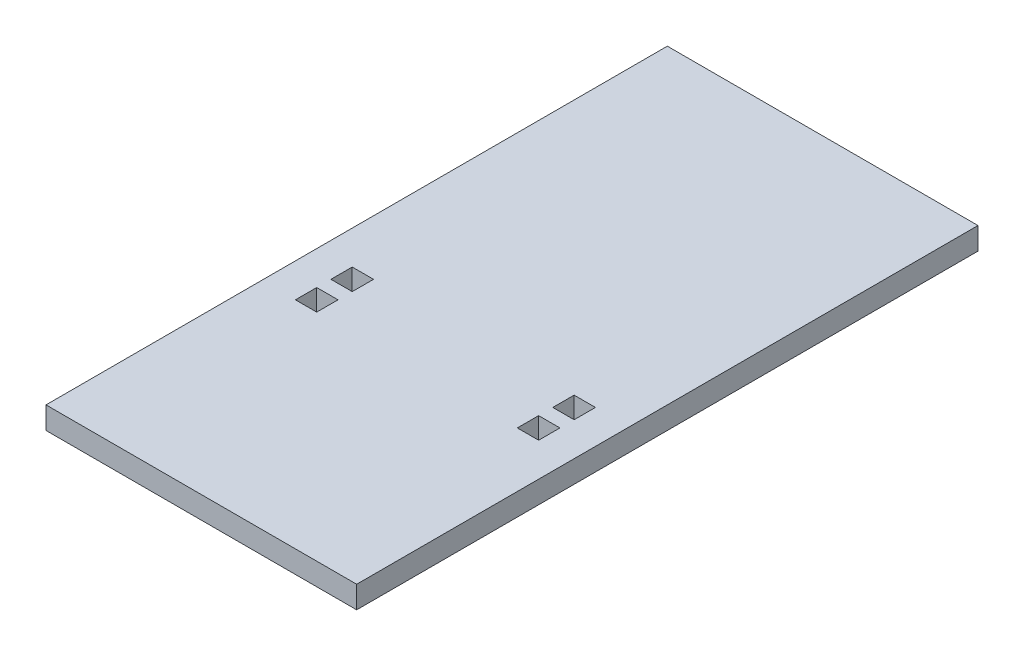
ISO-10303-21;
HEADER;
FILE_DESCRIPTION(('STEP AP214'),'2;1');
FILE_NAME('part.step','',(''),(''),'','','');
FILE_SCHEMA(('AUTOMOTIVE_DESIGN { 1 0 10303 214 1 1 1 1 }'));
ENDSEC;
DATA;
#1=APPLICATION_CONTEXT('core data for automotive mechanical design processes');
#2=APPLICATION_PROTOCOL_DEFINITION('international standard','automotive_design',2000,#1);
#3=PRODUCT_CONTEXT('',#1,'mechanical');
#4=PRODUCT('Part','Part','',(#3));
#5=PRODUCT_RELATED_PRODUCT_CATEGORY('part','',(#4));
#6=PRODUCT_DEFINITION_FORMATION('','',#4);
#7=PRODUCT_DEFINITION_CONTEXT('part definition',#1,'design');
#8=PRODUCT_DEFINITION('design','',#6,#7);
#9=PRODUCT_DEFINITION_SHAPE('','',#8);
#10=(LENGTH_UNIT() NAMED_UNIT(*) SI_UNIT(.MILLI.,.METRE.));
#11=(NAMED_UNIT(*) PLANE_ANGLE_UNIT() SI_UNIT($,.RADIAN.));
#12=(NAMED_UNIT(*) SI_UNIT($,.STERADIAN.) SOLID_ANGLE_UNIT());
#13=UNCERTAINTY_MEASURE_WITH_UNIT(LENGTH_MEASURE(1.E-05),#10,'distance_accuracy_value','');
#14=(GEOMETRIC_REPRESENTATION_CONTEXT(3) GLOBAL_UNCERTAINTY_ASSIGNED_CONTEXT((#13)) GLOBAL_UNIT_ASSIGNED_CONTEXT((#10,
#11,#12)) REPRESENTATION_CONTEXT('',''));
#15=CARTESIAN_POINT('',(0.,0.,0.));
#16=DIRECTION('',(0.,0.,1.));
#17=DIRECTION('',(1.,0.,0.));
#18=AXIS2_PLACEMENT_3D('',#15,#16,#17);
#19=CARTESIAN_POINT('',(0.,5.,0.));
#20=DIRECTION('',(0.,-1.,0.));
#21=DIRECTION('',(0.,0.,-1.));
#22=AXIS2_PLACEMENT_3D('',#19,#20,#21);
#23=PLANE('',#22);
#24=DIRECTION('',(-1.,0.,0.));
#25=VECTOR('',#24,1.);
#26=CARTESIAN_POINT('',(27.4,5.,8.60000000000003));
#27=LINE('',#26,#25);
#28=CARTESIAN_POINT('',(27.4,5.,8.60000000000003));
#29=VERTEX_POINT('',#28);
#30=CARTESIAN_POINT('',(22.6,5.,8.60000000000003));
#31=VERTEX_POINT('',#30);
#32=EDGE_CURVE('E208',#29,#31,#27,.T.);
#33=ORIENTED_EDGE('',*,*,#32,.F.);
#34=DIRECTION('',(0.,0.,-1.));
#35=VECTOR('',#34,1.);
#36=CARTESIAN_POINT('',(27.4,5.,8.60000000000003));
#37=LINE('',#36,#35);
#38=CARTESIAN_POINT('',(27.4,5.,13.4));
#39=VERTEX_POINT('',#38);
#40=EDGE_CURVE('E216',#39,#29,#37,.T.);
#41=ORIENTED_EDGE('',*,*,#40,.F.);
#42=DIRECTION('',(1.,0.,0.));
#43=VECTOR('',#42,1.);
#44=CARTESIAN_POINT('',(27.4,5.,13.4));
#45=LINE('',#44,#43);
#46=CARTESIAN_POINT('',(22.6,5.,13.4));
#47=VERTEX_POINT('',#46);
#48=EDGE_CURVE('E213',#47,#39,#45,.T.);
#49=ORIENTED_EDGE('',*,*,#48,.F.);
#50=DIRECTION('',(0.,0.,1.));
#51=VECTOR('',#50,1.);
#52=CARTESIAN_POINT('',(22.6,5.,8.60000000000003));
#53=LINE('',#52,#51);
#54=EDGE_CURVE('E210',#31,#47,#53,.T.);
#55=ORIENTED_EDGE('',*,*,#54,.F.);
#56=EDGE_LOOP('',(#33,#41,#49,#55));
#57=FACE_BOUND('',#56,.T.);
#58=DIRECTION('',(0.,0.,-1.));
#59=VECTOR('',#58,1.);
#60=CARTESIAN_POINT('',(-22.6,5.,21.4));
#61=LINE('',#60,#59);
#62=CARTESIAN_POINT('',(-22.6,5.,21.4));
#63=VERTEX_POINT('',#62);
#64=CARTESIAN_POINT('',(-22.6,5.,16.6));
#65=VERTEX_POINT('',#64);
#66=EDGE_CURVE('E270',#63,#65,#61,.T.);
#67=ORIENTED_EDGE('',*,*,#66,.F.);
#68=DIRECTION('',(1.,0.,0.));
#69=VECTOR('',#68,1.);
#70=CARTESIAN_POINT('',(-27.4,5.,21.4));
#71=LINE('',#70,#69);
#72=CARTESIAN_POINT('',(-27.4,5.,21.4));
#73=VERTEX_POINT('',#72);
#74=EDGE_CURVE('E278',#73,#63,#71,.T.);
#75=ORIENTED_EDGE('',*,*,#74,.F.);
#76=DIRECTION('',(0.,0.,1.));
#77=VECTOR('',#76,1.);
#78=CARTESIAN_POINT('',(-27.4,5.,21.4));
#79=LINE('',#78,#77);
#80=CARTESIAN_POINT('',(-27.4,5.,16.6));
#81=VERTEX_POINT('',#80);
#82=EDGE_CURVE('E275',#81,#73,#79,.T.);
#83=ORIENTED_EDGE('',*,*,#82,.F.);
#84=DIRECTION('',(-1.,0.,0.));
#85=VECTOR('',#84,1.);
#86=CARTESIAN_POINT('',(-27.4,5.,16.6));
#87=LINE('',#86,#85);
#88=EDGE_CURVE('E272',#65,#81,#87,.T.);
#89=ORIENTED_EDGE('',*,*,#88,.F.);
#90=EDGE_LOOP('',(#67,#75,#83,#89));
#91=FACE_BOUND('',#90,.T.);
#92=DIRECTION('',(0.,0.,1.));
#93=VECTOR('',#92,1.);
#94=CARTESIAN_POINT('',(-35.,5.,-70.));
#95=LINE('',#94,#93);
#96=CARTESIAN_POINT('',(-35.,5.,-70.));
#97=VERTEX_POINT('',#96);
#98=CARTESIAN_POINT('',(-35.,5.,70.));
#99=VERTEX_POINT('',#98);
#100=EDGE_CURVE('E301',#97,#99,#95,.T.);
#101=ORIENTED_EDGE('',*,*,#100,.T.);
#102=DIRECTION('',(1.,0.,0.));
#103=VECTOR('',#102,1.);
#104=CARTESIAN_POINT('',(35.,5.,70.));
#105=LINE('',#104,#103);
#106=CARTESIAN_POINT('',(35.,5.,70.));
#107=VERTEX_POINT('',#106);
#108=EDGE_CURVE('E304',#99,#107,#105,.T.);
#109=ORIENTED_EDGE('',*,*,#108,.T.);
#110=DIRECTION('',(0.,0.,-1.));
#111=VECTOR('',#110,1.);
#112=CARTESIAN_POINT('',(35.,5.,-70.));
#113=LINE('',#112,#111);
#114=CARTESIAN_POINT('',(35.,5.,-70.));
#115=VERTEX_POINT('',#114);
#116=EDGE_CURVE('E307',#107,#115,#113,.T.);
#117=ORIENTED_EDGE('',*,*,#116,.T.);
#118=DIRECTION('',(-1.,0.,0.));
#119=VECTOR('',#118,1.);
#120=CARTESIAN_POINT('',(35.,5.,-70.));
#121=LINE('',#120,#119);
#122=EDGE_CURVE('E309',#115,#97,#121,.T.);
#123=ORIENTED_EDGE('',*,*,#122,.T.);
#124=EDGE_LOOP('',(#101,#109,#117,#123));
#125=FACE_BOUND('',#124,.T.);
#126=DIRECTION('',(0.,0.,1.));
#127=VECTOR('',#126,1.);
#128=CARTESIAN_POINT('',(-27.4,5.,8.60000000000005));
#129=LINE('',#128,#127);
#130=CARTESIAN_POINT('',(-27.4,5.,8.60000000000005));
#131=VERTEX_POINT('',#130);
#132=CARTESIAN_POINT('',(-27.4,5.,13.4));
#133=VERTEX_POINT('',#132);
#134=EDGE_CURVE('E239',#131,#133,#129,.T.);
#135=ORIENTED_EDGE('',*,*,#134,.F.);
#136=DIRECTION('',(-1.,0.,0.));
#137=VECTOR('',#136,1.);
#138=CARTESIAN_POINT('',(-27.4,5.,8.60000000000005));
#139=LINE('',#138,#137);
#140=CARTESIAN_POINT('',(-22.6,5.,8.60000000000004));
#141=VERTEX_POINT('',#140);
#142=EDGE_CURVE('E247',#141,#131,#139,.T.);
#143=ORIENTED_EDGE('',*,*,#142,.F.);
#144=DIRECTION('',(0.,0.,-1.));
#145=VECTOR('',#144,1.);
#146=CARTESIAN_POINT('',(-22.6,5.,8.60000000000004));
#147=LINE('',#146,#145);
#148=CARTESIAN_POINT('',(-22.6,5.,13.4));
#149=VERTEX_POINT('',#148);
#150=EDGE_CURVE('E244',#149,#141,#147,.T.);
#151=ORIENTED_EDGE('',*,*,#150,.F.);
#152=DIRECTION('',(1.,0.,0.));
#153=VECTOR('',#152,1.);
#154=CARTESIAN_POINT('',(-27.4,5.,13.4));
#155=LINE('',#154,#153);
#156=EDGE_CURVE('E241',#133,#149,#155,.T.);
#157=ORIENTED_EDGE('',*,*,#156,.F.);
#158=EDGE_LOOP('',(#135,#143,#151,#157));
#159=FACE_BOUND('',#158,.T.);
#160=DIRECTION('',(0.,0.,-1.));
#161=VECTOR('',#160,1.);
#162=CARTESIAN_POINT('',(27.4,5.,21.4));
#163=LINE('',#162,#161);
#164=CARTESIAN_POINT('',(27.4,5.,21.4));
#165=VERTEX_POINT('',#164);
#166=CARTESIAN_POINT('',(27.4,5.,16.6));
#167=VERTEX_POINT('',#166);
#168=EDGE_CURVE('E172',#165,#167,#163,.T.);
#169=ORIENTED_EDGE('',*,*,#168,.F.);
#170=DIRECTION('',(1.,0.,0.));
#171=VECTOR('',#170,1.);
#172=CARTESIAN_POINT('',(27.4,5.,21.4));
#173=LINE('',#172,#171);
#174=CARTESIAN_POINT('',(22.6,5.,21.4));
#175=VERTEX_POINT('',#174);
#176=EDGE_CURVE('E194',#175,#165,#173,.T.);
#177=ORIENTED_EDGE('',*,*,#176,.F.);
#178=DIRECTION('',(0.,0.,1.));
#179=VECTOR('',#178,1.);
#180=CARTESIAN_POINT('',(22.6,5.,21.4));
#181=LINE('',#180,#179);
#182=CARTESIAN_POINT('',(22.6,5.,16.6));
#183=VERTEX_POINT('',#182);
#184=EDGE_CURVE('E192',#183,#175,#181,.T.);
#185=ORIENTED_EDGE('',*,*,#184,.F.);
#186=DIRECTION('',(-1.,0.,0.));
#187=VECTOR('',#186,1.);
#188=CARTESIAN_POINT('',(27.4,5.,16.6));
#189=LINE('',#188,#187);
#190=EDGE_CURVE('E180',#167,#183,#189,.T.);
#191=ORIENTED_EDGE('',*,*,#190,.F.);
#192=EDGE_LOOP('',(#169,#177,#185,#191));
#193=FACE_BOUND('',#192,.T.);
#194=ADVANCED_FACE('F35',(#57,#91,#125,#159,#193),#23,.F.);
#195=CARTESIAN_POINT('',(0.,0.,0.));
#196=DIRECTION('',(0.,-1.,0.));
#197=DIRECTION('',(0.,0.,-1.));
#198=AXIS2_PLACEMENT_3D('',#195,#196,#197);
#199=PLANE('',#198);
#200=DIRECTION('',(0.,0.,1.));
#201=VECTOR('',#200,1.);
#202=CARTESIAN_POINT('',(-35.,0.,-70.));
#203=LINE('',#202,#201);
#204=CARTESIAN_POINT('',(-35.,0.,-70.));
#205=VERTEX_POINT('',#204);
#206=CARTESIAN_POINT('',(-35.,0.,70.));
#207=VERTEX_POINT('',#206);
#208=EDGE_CURVE('E300',#205,#207,#203,.T.);
#209=ORIENTED_EDGE('',*,*,#208,.F.);
#210=DIRECTION('',(-1.,0.,0.));
#211=VECTOR('',#210,1.);
#212=CARTESIAN_POINT('',(35.,0.,-70.));
#213=LINE('',#212,#211);
#214=CARTESIAN_POINT('',(35.,0.,-70.));
#215=VERTEX_POINT('',#214);
#216=EDGE_CURVE('E305',#215,#205,#213,.T.);
#217=ORIENTED_EDGE('',*,*,#216,.F.);
#218=DIRECTION('',(0.,0.,-1.));
#219=VECTOR('',#218,1.);
#220=CARTESIAN_POINT('',(35.,0.,-70.));
#221=LINE('',#220,#219);
#222=CARTESIAN_POINT('',(35.,0.,70.));
#223=VERTEX_POINT('',#222);
#224=EDGE_CURVE('E316',#223,#215,#221,.T.);
#225=ORIENTED_EDGE('',*,*,#224,.F.);
#226=DIRECTION('',(1.,0.,0.));
#227=VECTOR('',#226,1.);
#228=CARTESIAN_POINT('',(35.,0.,70.));
#229=LINE('',#228,#227);
#230=EDGE_CURVE('E314',#207,#223,#229,.T.);
#231=ORIENTED_EDGE('',*,*,#230,.F.);
#232=EDGE_LOOP('',(#209,#217,#225,#231));
#233=FACE_BOUND('',#232,.T.);
#234=DIRECTION('',(1.,0.,0.));
#235=VECTOR('',#234,1.);
#236=CARTESIAN_POINT('',(-27.4,0.,21.4));
#237=LINE('',#236,#235);
#238=CARTESIAN_POINT('',(-27.4,0.,21.4));
#239=VERTEX_POINT('',#238);
#240=CARTESIAN_POINT('',(-22.6,0.,21.4));
#241=VERTEX_POINT('',#240);
#242=EDGE_CURVE('E273',#239,#241,#237,.T.);
#243=ORIENTED_EDGE('',*,*,#242,.T.);
#244=DIRECTION('',(0.,0.,-1.));
#245=VECTOR('',#244,1.);
#246=CARTESIAN_POINT('',(-22.6,0.,21.4));
#247=LINE('',#246,#245);
#248=CARTESIAN_POINT('',(-22.6,0.,16.6));
#249=VERTEX_POINT('',#248);
#250=EDGE_CURVE('E269',#241,#249,#247,.T.);
#251=ORIENTED_EDGE('',*,*,#250,.T.);
#252=DIRECTION('',(-1.,0.,0.));
#253=VECTOR('',#252,1.);
#254=CARTESIAN_POINT('',(-27.4,0.,16.6));
#255=LINE('',#254,#253);
#256=CARTESIAN_POINT('',(-27.4,0.,16.6));
#257=VERTEX_POINT('',#256);
#258=EDGE_CURVE('E283',#249,#257,#255,.T.);
#259=ORIENTED_EDGE('',*,*,#258,.T.);
#260=DIRECTION('',(0.,0.,1.));
#261=VECTOR('',#260,1.);
#262=CARTESIAN_POINT('',(-27.4,0.,21.4));
#263=LINE('',#262,#261);
#264=EDGE_CURVE('E286',#257,#239,#263,.T.);
#265=ORIENTED_EDGE('',*,*,#264,.T.);
#266=EDGE_LOOP('',(#243,#251,#259,#265));
#267=FACE_BOUND('',#266,.T.);
#268=DIRECTION('',(-1.,0.,0.));
#269=VECTOR('',#268,1.);
#270=CARTESIAN_POINT('',(-27.4,0.,8.60000000000005));
#271=LINE('',#270,#269);
#272=CARTESIAN_POINT('',(-22.6,0.,8.60000000000004));
#273=VERTEX_POINT('',#272);
#274=CARTESIAN_POINT('',(-27.4,0.,8.60000000000005));
#275=VERTEX_POINT('',#274);
#276=EDGE_CURVE('E242',#273,#275,#271,.T.);
#277=ORIENTED_EDGE('',*,*,#276,.T.);
#278=DIRECTION('',(0.,0.,1.));
#279=VECTOR('',#278,1.);
#280=CARTESIAN_POINT('',(-27.4,0.,8.60000000000005));
#281=LINE('',#280,#279);
#282=CARTESIAN_POINT('',(-27.4,0.,13.4));
#283=VERTEX_POINT('',#282);
#284=EDGE_CURVE('E238',#275,#283,#281,.T.);
#285=ORIENTED_EDGE('',*,*,#284,.T.);
#286=DIRECTION('',(1.,0.,0.));
#287=VECTOR('',#286,1.);
#288=CARTESIAN_POINT('',(-27.4,0.,13.4));
#289=LINE('',#288,#287);
#290=CARTESIAN_POINT('',(-22.6,0.,13.4));
#291=VERTEX_POINT('',#290);
#292=EDGE_CURVE('E252',#283,#291,#289,.T.);
#293=ORIENTED_EDGE('',*,*,#292,.T.);
#294=DIRECTION('',(0.,0.,-1.));
#295=VECTOR('',#294,1.);
#296=CARTESIAN_POINT('',(-22.6,0.,8.60000000000004));
#297=LINE('',#296,#295);
#298=EDGE_CURVE('E255',#291,#273,#297,.T.);
#299=ORIENTED_EDGE('',*,*,#298,.T.);
#300=EDGE_LOOP('',(#277,#285,#293,#299));
#301=FACE_BOUND('',#300,.T.);
#302=DIRECTION('',(0.,0.,-1.));
#303=VECTOR('',#302,1.);
#304=CARTESIAN_POINT('',(27.4,0.,8.60000000000003));
#305=LINE('',#304,#303);
#306=CARTESIAN_POINT('',(27.4,0.,13.4));
#307=VERTEX_POINT('',#306);
#308=CARTESIAN_POINT('',(27.4,0.,8.60000000000003));
#309=VERTEX_POINT('',#308);
#310=EDGE_CURVE('E211',#307,#309,#305,.T.);
#311=ORIENTED_EDGE('',*,*,#310,.T.);
#312=DIRECTION('',(-1.,0.,0.));
#313=VECTOR('',#312,1.);
#314=CARTESIAN_POINT('',(27.4,0.,8.60000000000003));
#315=LINE('',#314,#313);
#316=CARTESIAN_POINT('',(22.6,0.,8.60000000000003));
#317=VERTEX_POINT('',#316);
#318=EDGE_CURVE('E188',#309,#317,#315,.T.);
#319=ORIENTED_EDGE('',*,*,#318,.T.);
#320=DIRECTION('',(0.,0.,1.));
#321=VECTOR('',#320,1.);
#322=CARTESIAN_POINT('',(22.6,0.,8.60000000000003));
#323=LINE('',#322,#321);
#324=CARTESIAN_POINT('',(22.6,0.,13.4));
#325=VERTEX_POINT('',#324);
#326=EDGE_CURVE('E221',#317,#325,#323,.T.);
#327=ORIENTED_EDGE('',*,*,#326,.T.);
#328=DIRECTION('',(1.,0.,0.));
#329=VECTOR('',#328,1.);
#330=CARTESIAN_POINT('',(27.4,0.,13.4));
#331=LINE('',#330,#329);
#332=EDGE_CURVE('E224',#325,#307,#331,.T.);
#333=ORIENTED_EDGE('',*,*,#332,.T.);
#334=EDGE_LOOP('',(#311,#319,#327,#333));
#335=FACE_BOUND('',#334,.T.);
#336=DIRECTION('',(1.,0.,0.));
#337=VECTOR('',#336,1.);
#338=CARTESIAN_POINT('',(27.4,0.,21.4));
#339=LINE('',#338,#337);
#340=CARTESIAN_POINT('',(22.6,0.,21.4));
#341=VERTEX_POINT('',#340);
#342=CARTESIAN_POINT('',(27.4,0.,21.4));
#343=VERTEX_POINT('',#342);
#344=EDGE_CURVE('E181',#341,#343,#339,.T.);
#345=ORIENTED_EDGE('',*,*,#344,.T.);
#346=DIRECTION('',(0.,0.,-1.));
#347=VECTOR('',#346,1.);
#348=CARTESIAN_POINT('',(27.4,0.,21.4));
#349=LINE('',#348,#347);
#350=CARTESIAN_POINT('',(27.4,0.,16.6));
#351=VERTEX_POINT('',#350);
#352=EDGE_CURVE('E58',#343,#351,#349,.T.);
#353=ORIENTED_EDGE('',*,*,#352,.T.);
#354=DIRECTION('',(-1.,0.,0.));
#355=VECTOR('',#354,1.);
#356=CARTESIAN_POINT('',(27.4,0.,16.6));
#357=LINE('',#356,#355);
#358=CARTESIAN_POINT('',(22.6,0.,16.6));
#359=VERTEX_POINT('',#358);
#360=EDGE_CURVE('E187',#351,#359,#357,.T.);
#361=ORIENTED_EDGE('',*,*,#360,.T.);
#362=DIRECTION('',(0.,0.,1.));
#363=VECTOR('',#362,1.);
#364=CARTESIAN_POINT('',(22.6,0.,21.4));
#365=LINE('',#364,#363);
#366=EDGE_CURVE('E200',#359,#341,#365,.T.);
#367=ORIENTED_EDGE('',*,*,#366,.T.);
#368=EDGE_LOOP('',(#345,#353,#361,#367));
#369=FACE_BOUND('',#368,.T.);
#370=ADVANCED_FACE('F334',(#233,#267,#301,#335,#369),#199,.T.);
#371=CARTESIAN_POINT('',(-35.,5.,-70.));
#372=DIRECTION('',(1.,0.,0.));
#373=DIRECTION('',(0.,0.,-1.));
#374=AXIS2_PLACEMENT_3D('',#371,#372,#373);
#375=PLANE('',#374);
#376=ORIENTED_EDGE('',*,*,#208,.T.);
#377=DIRECTION('',(0.,-1.,0.));
#378=VECTOR('',#377,1.);
#379=CARTESIAN_POINT('',(-35.,5.,70.));
#380=LINE('',#379,#378);
#381=EDGE_CURVE('E11',#99,#207,#380,.T.);
#382=ORIENTED_EDGE('',*,*,#381,.F.);
#383=ORIENTED_EDGE('',*,*,#100,.F.);
#384=DIRECTION('',(0.,-1.,0.));
#385=VECTOR('',#384,1.);
#386=CARTESIAN_POINT('',(-35.,5.,-70.));
#387=LINE('',#386,#385);
#388=EDGE_CURVE('E311',#97,#205,#387,.T.);
#389=ORIENTED_EDGE('',*,*,#388,.T.);
#390=EDGE_LOOP('',(#376,#382,#383,#389));
#391=FACE_BOUND('',#390,.T.);
#392=ADVANCED_FACE('F37',(#391),#375,.F.);
#393=CARTESIAN_POINT('',(35.,5.,70.));
#394=DIRECTION('',(0.,0.,-1.));
#395=DIRECTION('',(-1.,0.,0.));
#396=AXIS2_PLACEMENT_3D('',#393,#394,#395);
#397=PLANE('',#396);
#398=ORIENTED_EDGE('',*,*,#230,.T.);
#399=DIRECTION('',(0.,-1.,0.));
#400=VECTOR('',#399,1.);
#401=CARTESIAN_POINT('',(35.,5.,70.));
#402=LINE('',#401,#400);
#403=EDGE_CURVE('E43',#107,#223,#402,.T.);
#404=ORIENTED_EDGE('',*,*,#403,.F.);
#405=ORIENTED_EDGE('',*,*,#108,.F.);
#406=ORIENTED_EDGE('',*,*,#381,.T.);
#407=EDGE_LOOP('',(#398,#404,#405,#406));
#408=FACE_BOUND('',#407,.T.);
#409=ADVANCED_FACE('F345',(#408),#397,.F.);
#410=CARTESIAN_POINT('',(35.,5.,-70.));
#411=DIRECTION('',(-1.,0.,0.));
#412=DIRECTION('',(0.,0.,1.));
#413=AXIS2_PLACEMENT_3D('',#410,#411,#412);
#414=PLANE('',#413);
#415=ORIENTED_EDGE('',*,*,#224,.T.);
#416=DIRECTION('',(0.,-1.,0.));
#417=VECTOR('',#416,1.);
#418=CARTESIAN_POINT('',(35.,5.,-70.));
#419=LINE('',#418,#417);
#420=EDGE_CURVE('E321',#115,#215,#419,.T.);
#421=ORIENTED_EDGE('',*,*,#420,.F.);
#422=ORIENTED_EDGE('',*,*,#116,.F.);
#423=ORIENTED_EDGE('',*,*,#403,.T.);
#424=EDGE_LOOP('',(#415,#421,#422,#423));
#425=FACE_BOUND('',#424,.T.);
#426=ADVANCED_FACE('F328',(#425),#414,.F.);
#427=CARTESIAN_POINT('',(35.,5.,-70.));
#428=DIRECTION('',(0.,0.,1.));
#429=DIRECTION('',(1.,0.,0.));
#430=AXIS2_PLACEMENT_3D('',#427,#428,#429);
#431=PLANE('',#430);
#432=ORIENTED_EDGE('',*,*,#216,.T.);
#433=ORIENTED_EDGE('',*,*,#388,.F.);
#434=ORIENTED_EDGE('',*,*,#122,.F.);
#435=ORIENTED_EDGE('',*,*,#420,.T.);
#436=EDGE_LOOP('',(#432,#433,#434,#435));
#437=FACE_BOUND('',#436,.T.);
#438=ADVANCED_FACE('F338',(#437),#431,.F.);
#439=CARTESIAN_POINT('',(-22.6,5.,21.4));
#440=DIRECTION('',(-1.,0.,0.));
#441=DIRECTION('',(0.,0.,1.));
#442=AXIS2_PLACEMENT_3D('',#439,#440,#441);
#443=PLANE('',#442);
#444=ORIENTED_EDGE('',*,*,#250,.F.);
#445=DIRECTION('',(0.,-1.,0.));
#446=VECTOR('',#445,1.);
#447=CARTESIAN_POINT('',(-22.6,5.,21.4));
#448=LINE('',#447,#446);
#449=EDGE_CURVE('E280',#63,#241,#448,.T.);
#450=ORIENTED_EDGE('',*,*,#449,.F.);
#451=ORIENTED_EDGE('',*,*,#66,.T.);
#452=DIRECTION('',(0.,-1.,0.));
#453=VECTOR('',#452,1.);
#454=CARTESIAN_POINT('',(-22.6,5.,16.6));
#455=LINE('',#454,#453);
#456=EDGE_CURVE('E297',#65,#249,#455,.T.);
#457=ORIENTED_EDGE('',*,*,#456,.T.);
#458=EDGE_LOOP('',(#444,#450,#451,#457));
#459=FACE_BOUND('',#458,.T.);
#460=ADVANCED_FACE('F362',(#459),#443,.T.);
#461=CARTESIAN_POINT('',(-27.4,5.,16.6));
#462=DIRECTION('',(0.,0.,1.));
#463=DIRECTION('',(1.,0.,0.));
#464=AXIS2_PLACEMENT_3D('',#461,#462,#463);
#465=PLANE('',#464);
#466=ORIENTED_EDGE('',*,*,#258,.F.);
#467=ORIENTED_EDGE('',*,*,#456,.F.);
#468=ORIENTED_EDGE('',*,*,#88,.T.);
#469=DIRECTION('',(0.,-1.,0.));
#470=VECTOR('',#469,1.);
#471=CARTESIAN_POINT('',(-27.4,5.,16.6));
#472=LINE('',#471,#470);
#473=EDGE_CURVE('E295',#81,#257,#472,.T.);
#474=ORIENTED_EDGE('',*,*,#473,.T.);
#475=EDGE_LOOP('',(#466,#467,#468,#474));
#476=FACE_BOUND('',#475,.T.);
#477=ADVANCED_FACE('F369',(#476),#465,.T.);
#478=CARTESIAN_POINT('',(-27.4,5.,21.4));
#479=DIRECTION('',(1.,0.,0.));
#480=DIRECTION('',(0.,0.,-1.));
#481=AXIS2_PLACEMENT_3D('',#478,#479,#480);
#482=PLANE('',#481);
#483=ORIENTED_EDGE('',*,*,#264,.F.);
#484=ORIENTED_EDGE('',*,*,#473,.F.);
#485=ORIENTED_EDGE('',*,*,#82,.T.);
#486=DIRECTION('',(0.,-1.,0.));
#487=VECTOR('',#486,1.);
#488=CARTESIAN_POINT('',(-27.4,5.,21.4));
#489=LINE('',#488,#487);
#490=EDGE_CURVE('E293',#73,#239,#489,.T.);
#491=ORIENTED_EDGE('',*,*,#490,.T.);
#492=EDGE_LOOP('',(#483,#484,#485,#491));
#493=FACE_BOUND('',#492,.T.);
#494=ADVANCED_FACE('F374',(#493),#482,.T.);
#495=CARTESIAN_POINT('',(-27.4,5.,21.4));
#496=DIRECTION('',(0.,0.,-1.));
#497=DIRECTION('',(-1.,0.,0.));
#498=AXIS2_PLACEMENT_3D('',#495,#496,#497);
#499=PLANE('',#498);
#500=ORIENTED_EDGE('',*,*,#242,.F.);
#501=ORIENTED_EDGE('',*,*,#490,.F.);
#502=ORIENTED_EDGE('',*,*,#74,.T.);
#503=ORIENTED_EDGE('',*,*,#449,.T.);
#504=EDGE_LOOP('',(#500,#501,#502,#503));
#505=FACE_BOUND('',#504,.T.);
#506=ADVANCED_FACE('F381',(#505),#499,.T.);
#507=CARTESIAN_POINT('',(-27.4,5.,8.60000000000005));
#508=DIRECTION('',(1.,0.,0.));
#509=DIRECTION('',(0.,0.,-1.));
#510=AXIS2_PLACEMENT_3D('',#507,#508,#509);
#511=PLANE('',#510);
#512=ORIENTED_EDGE('',*,*,#284,.F.);
#513=DIRECTION('',(0.,-1.,0.));
#514=VECTOR('',#513,1.);
#515=CARTESIAN_POINT('',(-27.4,5.,8.60000000000005));
#516=LINE('',#515,#514);
#517=EDGE_CURVE('E249',#131,#275,#516,.T.);
#518=ORIENTED_EDGE('',*,*,#517,.F.);
#519=ORIENTED_EDGE('',*,*,#134,.T.);
#520=DIRECTION('',(0.,-1.,0.));
#521=VECTOR('',#520,1.);
#522=CARTESIAN_POINT('',(-27.4,5.,13.4));
#523=LINE('',#522,#521);
#524=EDGE_CURVE('E266',#133,#283,#523,.T.);
#525=ORIENTED_EDGE('',*,*,#524,.T.);
#526=EDGE_LOOP('',(#512,#518,#519,#525));
#527=FACE_BOUND('',#526,.T.);
#528=ADVANCED_FACE('F394',(#527),#511,.T.);
#529=CARTESIAN_POINT('',(-27.4,5.,13.4));
#530=DIRECTION('',(0.,0.,-1.));
#531=DIRECTION('',(-1.,0.,0.));
#532=AXIS2_PLACEMENT_3D('',#529,#530,#531);
#533=PLANE('',#532);
#534=ORIENTED_EDGE('',*,*,#292,.F.);
#535=ORIENTED_EDGE('',*,*,#524,.F.);
#536=ORIENTED_EDGE('',*,*,#156,.T.);
#537=DIRECTION('',(0.,-1.,0.));
#538=VECTOR('',#537,1.);
#539=CARTESIAN_POINT('',(-22.6,5.,13.4));
#540=LINE('',#539,#538);
#541=EDGE_CURVE('E264',#149,#291,#540,.T.);
#542=ORIENTED_EDGE('',*,*,#541,.T.);
#543=EDGE_LOOP('',(#534,#535,#536,#542));
#544=FACE_BOUND('',#543,.T.);
#545=ADVANCED_FACE('F399',(#544),#533,.T.);
#546=CARTESIAN_POINT('',(-22.6,5.,8.60000000000004));
#547=DIRECTION('',(-1.,0.,0.));
#548=DIRECTION('',(0.,0.,1.));
#549=AXIS2_PLACEMENT_3D('',#546,#547,#548);
#550=PLANE('',#549);
#551=ORIENTED_EDGE('',*,*,#298,.F.);
#552=ORIENTED_EDGE('',*,*,#541,.F.);
#553=ORIENTED_EDGE('',*,*,#150,.T.);
#554=DIRECTION('',(0.,-1.,0.));
#555=VECTOR('',#554,1.);
#556=CARTESIAN_POINT('',(-22.6,5.,8.60000000000004));
#557=LINE('',#556,#555);
#558=EDGE_CURVE('E262',#141,#273,#557,.T.);
#559=ORIENTED_EDGE('',*,*,#558,.T.);
#560=EDGE_LOOP('',(#551,#552,#553,#559));
#561=FACE_BOUND('',#560,.T.);
#562=ADVANCED_FACE('F403',(#561),#550,.T.);
#563=CARTESIAN_POINT('',(-27.4,5.,8.60000000000005));
#564=DIRECTION('',(0.,0.,1.));
#565=DIRECTION('',(1.,0.,0.));
#566=AXIS2_PLACEMENT_3D('',#563,#564,#565);
#567=PLANE('',#566);
#568=ORIENTED_EDGE('',*,*,#276,.F.);
#569=ORIENTED_EDGE('',*,*,#558,.F.);
#570=ORIENTED_EDGE('',*,*,#142,.T.);
#571=ORIENTED_EDGE('',*,*,#517,.T.);
#572=EDGE_LOOP('',(#568,#569,#570,#571));
#573=FACE_BOUND('',#572,.T.);
#574=ADVANCED_FACE('F407',(#573),#567,.T.);
#575=CARTESIAN_POINT('',(27.4,5.,8.60000000000003));
#576=DIRECTION('',(0.,0.,1.));
#577=DIRECTION('',(1.,0.,0.));
#578=AXIS2_PLACEMENT_3D('',#575,#576,#577);
#579=PLANE('',#578);
#580=ORIENTED_EDGE('',*,*,#318,.F.);
#581=DIRECTION('',(0.,-1.,0.));
#582=VECTOR('',#581,1.);
#583=CARTESIAN_POINT('',(27.4,5.,8.60000000000003));
#584=LINE('',#583,#582);
#585=EDGE_CURVE('E218',#29,#309,#584,.T.);
#586=ORIENTED_EDGE('',*,*,#585,.F.);
#587=ORIENTED_EDGE('',*,*,#32,.T.);
#588=DIRECTION('',(0.,-1.,0.));
#589=VECTOR('',#588,1.);
#590=CARTESIAN_POINT('',(22.6,5.,8.60000000000003));
#591=LINE('',#590,#589);
#592=EDGE_CURVE('E235',#31,#317,#591,.T.);
#593=ORIENTED_EDGE('',*,*,#592,.T.);
#594=EDGE_LOOP('',(#580,#586,#587,#593));
#595=FACE_BOUND('',#594,.T.);
#596=ADVANCED_FACE('F411',(#595),#579,.T.);
#597=CARTESIAN_POINT('',(22.6,5.,8.60000000000003));
#598=DIRECTION('',(1.,0.,0.));
#599=DIRECTION('',(0.,0.,-1.));
#600=AXIS2_PLACEMENT_3D('',#597,#598,#599);
#601=PLANE('',#600);
#602=ORIENTED_EDGE('',*,*,#326,.F.);
#603=ORIENTED_EDGE('',*,*,#592,.F.);
#604=ORIENTED_EDGE('',*,*,#54,.T.);
#605=DIRECTION('',(0.,-1.,0.));
#606=VECTOR('',#605,1.);
#607=CARTESIAN_POINT('',(22.6,5.,13.4));
#608=LINE('',#607,#606);
#609=EDGE_CURVE('E233',#47,#325,#608,.T.);
#610=ORIENTED_EDGE('',*,*,#609,.T.);
#611=EDGE_LOOP('',(#602,#603,#604,#610));
#612=FACE_BOUND('',#611,.T.);
#613=ADVANCED_FACE('F415',(#612),#601,.T.);
#614=CARTESIAN_POINT('',(27.4,5.,13.4));
#615=DIRECTION('',(0.,0.,-1.));
#616=DIRECTION('',(-1.,0.,0.));
#617=AXIS2_PLACEMENT_3D('',#614,#615,#616);
#618=PLANE('',#617);
#619=ORIENTED_EDGE('',*,*,#332,.F.);
#620=ORIENTED_EDGE('',*,*,#609,.F.);
#621=ORIENTED_EDGE('',*,*,#48,.T.);
#622=DIRECTION('',(0.,-1.,0.));
#623=VECTOR('',#622,1.);
#624=CARTESIAN_POINT('',(27.4,5.,13.4));
#625=LINE('',#624,#623);
#626=EDGE_CURVE('E231',#39,#307,#625,.T.);
#627=ORIENTED_EDGE('',*,*,#626,.T.);
#628=EDGE_LOOP('',(#619,#620,#621,#627));
#629=FACE_BOUND('',#628,.T.);
#630=ADVANCED_FACE('F419',(#629),#618,.T.);
#631=CARTESIAN_POINT('',(27.4,5.,8.60000000000003));
#632=DIRECTION('',(-1.,0.,0.));
#633=DIRECTION('',(0.,0.,1.));
#634=AXIS2_PLACEMENT_3D('',#631,#632,#633);
#635=PLANE('',#634);
#636=ORIENTED_EDGE('',*,*,#310,.F.);
#637=ORIENTED_EDGE('',*,*,#626,.F.);
#638=ORIENTED_EDGE('',*,*,#40,.T.);
#639=ORIENTED_EDGE('',*,*,#585,.T.);
#640=EDGE_LOOP('',(#636,#637,#638,#639));
#641=FACE_BOUND('',#640,.T.);
#642=ADVANCED_FACE('F423',(#641),#635,.T.);
#643=CARTESIAN_POINT('',(27.4,5.,21.4));
#644=DIRECTION('',(-1.,0.,0.));
#645=DIRECTION('',(0.,0.,1.));
#646=AXIS2_PLACEMENT_3D('',#643,#644,#645);
#647=PLANE('',#646);
#648=ORIENTED_EDGE('',*,*,#352,.F.);
#649=DIRECTION('',(0.,-1.,0.));
#650=VECTOR('',#649,1.);
#651=CARTESIAN_POINT('',(27.4,5.,21.4));
#652=LINE('',#651,#650);
#653=EDGE_CURVE('E176',#165,#343,#652,.T.);
#654=ORIENTED_EDGE('',*,*,#653,.F.);
#655=ORIENTED_EDGE('',*,*,#168,.T.);
#656=DIRECTION('',(0.,-1.,0.));
#657=VECTOR('',#656,1.);
#658=CARTESIAN_POINT('',(27.4,5.,16.6));
#659=LINE('',#658,#657);
#660=EDGE_CURVE('E175',#167,#351,#659,.T.);
#661=ORIENTED_EDGE('',*,*,#660,.T.);
#662=EDGE_LOOP('',(#648,#654,#655,#661));
#663=FACE_BOUND('',#662,.T.);
#664=ADVANCED_FACE('F174',(#663),#647,.T.);
#665=CARTESIAN_POINT('',(27.4,5.,16.6));
#666=DIRECTION('',(0.,0.,1.));
#667=DIRECTION('',(1.,0.,0.));
#668=AXIS2_PLACEMENT_3D('',#665,#666,#667);
#669=PLANE('',#668);
#670=ORIENTED_EDGE('',*,*,#360,.F.);
#671=ORIENTED_EDGE('',*,*,#660,.F.);
#672=ORIENTED_EDGE('',*,*,#190,.T.);
#673=DIRECTION('',(0.,-1.,0.));
#674=VECTOR('',#673,1.);
#675=CARTESIAN_POINT('',(22.6,5.,16.6));
#676=LINE('',#675,#674);
#677=EDGE_CURVE('E189',#183,#359,#676,.T.);
#678=ORIENTED_EDGE('',*,*,#677,.T.);
#679=EDGE_LOOP('',(#670,#671,#672,#678));
#680=FACE_BOUND('',#679,.T.);
#681=ADVANCED_FACE('F184',(#680),#669,.T.);
#682=CARTESIAN_POINT('',(22.6,5.,21.4));
#683=DIRECTION('',(1.,0.,0.));
#684=DIRECTION('',(0.,0.,-1.));
#685=AXIS2_PLACEMENT_3D('',#682,#683,#684);
#686=PLANE('',#685);
#687=ORIENTED_EDGE('',*,*,#366,.F.);
#688=ORIENTED_EDGE('',*,*,#677,.F.);
#689=ORIENTED_EDGE('',*,*,#184,.T.);
#690=DIRECTION('',(0.,-1.,0.));
#691=VECTOR('',#690,1.);
#692=CARTESIAN_POINT('',(22.6,5.,21.4));
#693=LINE('',#692,#691);
#694=EDGE_CURVE('E50',#175,#341,#693,.T.);
#695=ORIENTED_EDGE('',*,*,#694,.T.);
#696=EDGE_LOOP('',(#687,#688,#689,#695));
#697=FACE_BOUND('',#696,.T.);
#698=ADVANCED_FACE('F432',(#697),#686,.T.);
#699=CARTESIAN_POINT('',(27.4,5.,21.4));
#700=DIRECTION('',(0.,0.,-1.));
#701=DIRECTION('',(-1.,0.,0.));
#702=AXIS2_PLACEMENT_3D('',#699,#700,#701);
#703=PLANE('',#702);
#704=ORIENTED_EDGE('',*,*,#344,.F.);
#705=ORIENTED_EDGE('',*,*,#694,.F.);
#706=ORIENTED_EDGE('',*,*,#176,.T.);
#707=ORIENTED_EDGE('',*,*,#653,.T.);
#708=EDGE_LOOP('',(#704,#705,#706,#707));
#709=FACE_BOUND('',#708,.T.);
#710=ADVANCED_FACE('F435',(#709),#703,.T.);
#711=CLOSED_SHELL('',(#194,#370,#392,#409,#426,#438,#460,#477,#494,#506,#528,#545,#562,#574,
#596,#613,#630,#642,#664,#681,#698,#710));
#712=MANIFOLD_SOLID_BREP('B2',#711);
#713=ADVANCED_BREP_SHAPE_REPRESENTATION('',(#18,#712),#14);
#714=SHAPE_DEFINITION_REPRESENTATION(#9,#713);
ENDSEC;
END-ISO-10303-21;
